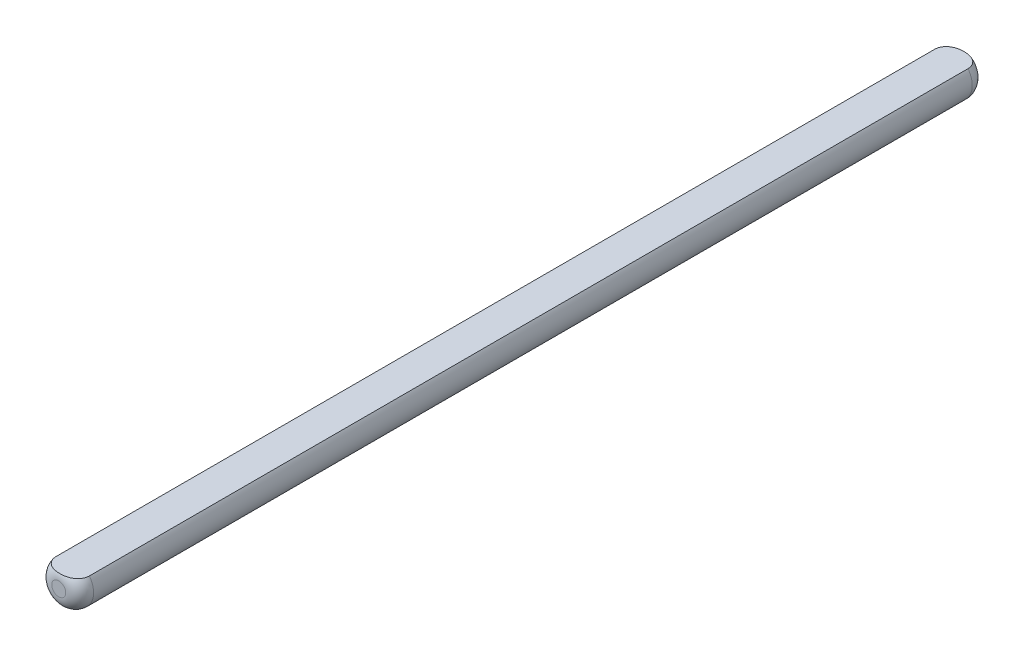
ISO-10303-21;
HEADER;
FILE_DESCRIPTION(('STEP AP214'),'2;1');
FILE_NAME('part.step','',(''),(''),'','','');
FILE_SCHEMA(('AUTOMOTIVE_DESIGN { 1 0 10303 214 1 1 1 1 }'));
ENDSEC;
DATA;
#1=APPLICATION_CONTEXT('core data for automotive mechanical design processes');
#2=APPLICATION_PROTOCOL_DEFINITION('international standard','automotive_design',2000,#1);
#3=PRODUCT_CONTEXT('',#1,'mechanical');
#4=PRODUCT('Part','Part','',(#3));
#5=PRODUCT_RELATED_PRODUCT_CATEGORY('part','',(#4));
#6=PRODUCT_DEFINITION_FORMATION('','',#4);
#7=PRODUCT_DEFINITION_CONTEXT('part definition',#1,'design');
#8=PRODUCT_DEFINITION('design','',#6,#7);
#9=PRODUCT_DEFINITION_SHAPE('','',#8);
#10=(LENGTH_UNIT() NAMED_UNIT(*) SI_UNIT(.MILLI.,.METRE.));
#11=(NAMED_UNIT(*) PLANE_ANGLE_UNIT() SI_UNIT($,.RADIAN.));
#12=(NAMED_UNIT(*) SI_UNIT($,.STERADIAN.) SOLID_ANGLE_UNIT());
#13=UNCERTAINTY_MEASURE_WITH_UNIT(LENGTH_MEASURE(1.E-05),#10,'distance_accuracy_value','');
#14=(GEOMETRIC_REPRESENTATION_CONTEXT(3) GLOBAL_UNCERTAINTY_ASSIGNED_CONTEXT((#13)) GLOBAL_UNIT_ASSIGNED_CONTEXT((#10,
#11,#12)) REPRESENTATION_CONTEXT('',''));
#15=CARTESIAN_POINT('',(0.,0.,0.));
#16=DIRECTION('',(0.,0.,1.));
#17=DIRECTION('',(1.,0.,0.));
#18=AXIS2_PLACEMENT_3D('',#15,#16,#17);
#19=CARTESIAN_POINT('',(0.,0.,130.));
#20=DIRECTION('',(0.,0.,-1.));
#21=DIRECTION('',(-1.,0.,0.));
#22=AXIS2_PLACEMENT_3D('',#19,#20,#21);
#23=CYLINDRICAL_SURFACE('',#22,3.);
#24=CARTESIAN_POINT('',(0.,0.,128.));
#25=DIRECTION('',(0.,0.,1.));
#26=DIRECTION('',(1.,0.,0.));
#27=AXIS2_PLACEMENT_3D('',#24,#25,#26);
#28=CIRCLE('',#27,3.);
#29=CARTESIAN_POINT('',(2.4,1.8,128.));
#30=VERTEX_POINT('',#29);
#31=CARTESIAN_POINT('',(-2.4,1.8,128.));
#32=VERTEX_POINT('',#31);
#33=EDGE_CURVE('E69',#30,#32,#28,.F.);
#34=ORIENTED_EDGE('',*,*,#33,.T.);
#35=DIRECTION('',(0.,0.,-1.));
#36=VECTOR('',#35,1.);
#37=CARTESIAN_POINT('',(-2.4,1.8,130.));
#38=LINE('',#37,#36);
#39=CARTESIAN_POINT('',(-2.4,1.8,2.));
#40=VERTEX_POINT('',#39);
#41=EDGE_CURVE('E52',#32,#40,#38,.T.);
#42=ORIENTED_EDGE('',*,*,#41,.T.);
#43=CARTESIAN_POINT('',(0.,0.,2.));
#44=DIRECTION('',(0.,0.,1.));
#45=DIRECTION('',(1.,0.,0.));
#46=AXIS2_PLACEMENT_3D('',#43,#44,#45);
#47=CIRCLE('',#46,3.);
#48=CARTESIAN_POINT('',(2.4,1.8,2.));
#49=VERTEX_POINT('',#48);
#50=EDGE_CURVE('E71',#40,#49,#47,.T.);
#51=ORIENTED_EDGE('',*,*,#50,.T.);
#52=DIRECTION('',(0.,0.,-1.));
#53=VECTOR('',#52,1.);
#54=CARTESIAN_POINT('',(2.4,1.8,130.));
#55=LINE('',#54,#53);
#56=EDGE_CURVE('E63',#49,#30,#55,.F.);
#57=ORIENTED_EDGE('',*,*,#56,.T.);
#58=EDGE_LOOP('',(#34,#42,#51,#57));
#59=FACE_BOUND('',#58,.T.);
#60=ADVANCED_FACE('F33',(#59),#23,.T.);
#61=CARTESIAN_POINT('',(0.,0.,130.));
#62=DIRECTION('',(0.,0.,1.));
#63=DIRECTION('',(1.,0.,0.));
#64=AXIS2_PLACEMENT_3D('',#61,#62,#63);
#65=PLANE('',#64);
#66=CARTESIAN_POINT('',(0.,0.,130.));
#67=DIRECTION('',(0.,0.,1.));
#68=DIRECTION('',(1.,0.,0.));
#69=AXIS2_PLACEMENT_3D('',#66,#67,#68);
#70=CIRCLE('',#69,1.);
#71=CARTESIAN_POINT('',(1.,0.,130.));
#72=VERTEX_POINT('',#71);
#73=EDGE_CURVE('E46',#72,#72,#70,.T.);
#74=ORIENTED_EDGE('',*,*,#73,.T.);
#75=EDGE_LOOP('',(#74));
#76=FACE_BOUND('',#75,.T.);
#77=ADVANCED_FACE('F87',(#76),#65,.T.);
#78=CARTESIAN_POINT('',(0.,0.,0.));
#79=DIRECTION('',(0.,0.,1.));
#80=DIRECTION('',(1.,0.,0.));
#81=AXIS2_PLACEMENT_3D('',#78,#79,#80);
#82=PLANE('',#81);
#83=CARTESIAN_POINT('',(0.,0.,0.));
#84=DIRECTION('',(0.,0.,1.));
#85=DIRECTION('',(1.,0.,0.));
#86=AXIS2_PLACEMENT_3D('',#83,#84,#85);
#87=CIRCLE('',#86,1.);
#88=CARTESIAN_POINT('',(1.,0.,0.));
#89=VERTEX_POINT('',#88);
#90=EDGE_CURVE('E75',#89,#89,#87,.F.);
#91=ORIENTED_EDGE('',*,*,#90,.T.);
#92=EDGE_LOOP('',(#91));
#93=FACE_BOUND('',#92,.T.);
#94=ADVANCED_FACE('F94',(#93),#82,.F.);
#95=CARTESIAN_POINT('',(0.,0.,2.));
#96=DIRECTION('',(0.,0.,1.));
#97=DIRECTION('',(1.,0.,0.));
#98=AXIS2_PLACEMENT_3D('',#95,#96,#97);
#99=DEGENERATE_TOROIDAL_SURFACE('',#98,1.,2.,.T.);
#100=CARTESIAN_POINT('',(0.,1.8,0.166969722017666));
#101=CARTESIAN_POINT('',(-0.0986785998941134,1.8,0.166975238087045));
#102=CARTESIAN_POINT('',(-0.197346529839382,1.8,0.170477675450817));
#103=CARTESIAN_POINT('',(-0.394209548449965,1.8,0.184913042187482));
#104=CARTESIAN_POINT('',(-0.492404397458323,1.8,0.195849405599045));
#105=CARTESIAN_POINT('',(-0.68720081067676,1.8,0.226181270819594));
#106=CARTESIAN_POINT('',(-0.783806454655332,1.8,0.245549708164188));
#107=CARTESIAN_POINT('',(-0.974465262182511,1.8,0.294071757687691));
#108=CARTESIAN_POINT('',(-1.06852108624494,1.8,0.323214710018872));
#109=CARTESIAN_POINT('',(-1.26583029774225,1.8,0.397560041627408));
#110=CARTESIAN_POINT('',(-1.36845768235951,1.8,0.444470717419789));
#111=CARTESIAN_POINT('',(-1.56509122123428,1.8,0.553888295113033));
#112=CARTESIAN_POINT('',(-1.65910198708867,1.8,0.616386787004061));
#113=CARTESIAN_POINT('',(-1.83552651616728,1.8,0.757508666797526));
#114=CARTESIAN_POINT('',(-1.91784068816743,1.8,0.836257975190657));
#115=CARTESIAN_POINT('',(-2.065979104658,1.8,1.00807150942055));
#116=CARTESIAN_POINT('',(-2.13180888155012,1.8,1.10113091561127));
#117=CARTESIAN_POINT('',(-2.23720083061211,1.8,1.28754255388353));
#118=CARTESIAN_POINT('',(-2.27887474437677,1.8,1.3797028054003));
#119=CARTESIAN_POINT('',(-2.34452577229867,1.8,1.57011541648018));
#120=CARTESIAN_POINT('',(-2.36851347657191,1.8,1.66836409215646));
#121=CARTESIAN_POINT('',(-2.39644764661969,1.8,1.85915363798996));
#122=CARTESIAN_POINT('',(-2.40191765680888,1.8,1.95147438490739));
#123=CARTESIAN_POINT('',(-2.39689553554796,1.8,2.13567111565641));
#124=CARTESIAN_POINT('',(-2.38640678592952,1.8,2.2275471895803));
#125=CARTESIAN_POINT('',(-2.35030117415979,1.8,2.40613408615349));
#126=CARTESIAN_POINT('',(-2.32502501802913,1.8,2.49291427573677));
#127=CARTESIAN_POINT('',(-2.26058356546414,1.8,2.66113019876751));
#128=CARTESIAN_POINT('',(-2.22141882918956,1.8,2.74256614760406));
#129=CARTESIAN_POINT('',(-2.12955683902653,1.8,2.89994959923916));
#130=CARTESIAN_POINT('',(-2.07656511403947,1.8,2.97572467287087));
#131=CARTESIAN_POINT('',(-1.95939791386091,1.8,3.11806122730967));
#132=CARTESIAN_POINT('',(-1.89521774629078,1.8,3.18461882125054));
#133=CARTESIAN_POINT('',(-1.75271671613515,1.8,3.31204250166765));
#134=CARTESIAN_POINT('',(-1.67370313469296,1.8,3.37213038880669));
#135=CARTESIAN_POINT('',(-1.50786459976306,1.8,3.48010981150634));
#136=CARTESIAN_POINT('',(-1.42104320451761,1.8,3.52800686503826));
#137=CARTESIAN_POINT('',(-1.26390306676421,1.8,3.60175998818603));
#138=CARTESIAN_POINT('',(-1.19474255503857,1.8,3.63014162439646));
#139=CARTESIAN_POINT('',(-1.05416593877488,1.8,3.68063819903391));
#140=CARTESIAN_POINT('',(-0.982749379954744,1.8,3.70275186627457));
#141=CARTESIAN_POINT('',(-0.838034036058117,1.8,3.74134266505989));
#142=CARTESIAN_POINT('',(-0.76472741262721,1.8,3.75778998184676));
#143=CARTESIAN_POINT('',(-0.617157947681998,1.8,3.78549164477229));
#144=CARTESIAN_POINT('',(-0.542895096326035,1.8,3.7967459374195));
#145=CARTESIAN_POINT('',(-0.358348827697383,1.8,3.81888706504936));
#146=CARTESIAN_POINT('',(-0.247737219781189,1.8,3.82705178049354));
#147=CARTESIAN_POINT('',(-0.0261563081097727,1.8,3.83445046479966));
#148=CARTESIAN_POINT('',(0.0848132146458739,1.8,3.83367710165681));
#149=CARTESIAN_POINT('',(0.306020069167073,1.8,3.82307860982982));
#150=CARTESIAN_POINT('',(0.416258594625243,1.8,3.8132801259526));
#151=CARTESIAN_POINT('',(0.635242041818319,1.8,3.7833889265005));
#152=CARTESIAN_POINT('',(0.74398862547722,1.8,3.76330881655314));
#153=CARTESIAN_POINT('',(0.970440557346135,1.8,3.70805597598123));
#154=CARTESIAN_POINT('',(1.08781482330207,1.8,3.6714655182648));
#155=CARTESIAN_POINT('',(1.31559913991839,1.8,3.58089149859709));
#156=CARTESIAN_POINT('',(1.42602039299972,1.8,3.52693681748993));
#157=CARTESIAN_POINT('',(1.63698214306462,1.8,3.39965509628724));
#158=CARTESIAN_POINT('',(1.73739712118393,1.8,3.32611638038127));
#159=CARTESIAN_POINT('',(1.92177182460297,1.8,3.16048672940832));
#160=CARTESIAN_POINT('',(2.00573510880869,1.8,3.06839981553315));
#161=CARTESIAN_POINT('',(2.14170378773492,1.8,2.88268700099884));
#162=CARTESIAN_POINT('',(2.19655590053385,1.8,2.7911424114992));
#163=CARTESIAN_POINT('',(2.28775023694629,1.8,2.59927472144413));
#164=CARTESIAN_POINT('',(2.32410951262713,1.8,2.49895980833114));
#165=CARTESIAN_POINT('',(2.37344556135317,1.8,2.30513950926308));
#166=CARTESIAN_POINT('',(2.38864566212387,1.8,2.2121942845736));
#167=CARTESIAN_POINT('',(2.40254652843964,1.8,2.02508558426061));
#168=CARTESIAN_POINT('',(2.40125250179713,1.8,1.93092250254016));
#169=CARTESIAN_POINT('',(2.38259230347494,1.8,1.74786718588304));
#170=CARTESIAN_POINT('',(2.36584296863454,1.8,1.65891112953878));
#171=CARTESIAN_POINT('',(2.3177948786314,1.8,1.48503513443969));
#172=CARTESIAN_POINT('',(2.28649679833613,1.8,1.40011500867296));
#173=CARTESIAN_POINT('',(2.21011098434111,1.8,1.23563696772895));
#174=CARTESIAN_POINT('',(2.16487938683766,1.8,1.15614609480629));
#175=CARTESIAN_POINT('',(2.06239114822016,1.8,1.00536938877244));
#176=CARTESIAN_POINT('',(2.00513292643795,1.8,0.934084636106138));
#177=CARTESIAN_POINT('',(1.87694794583826,1.8,0.797209267821055));
#178=CARTESIAN_POINT('',(1.80542713631104,1.8,0.732176714614894));
#179=CARTESIAN_POINT('',(1.6535258887066,1.8,0.613512927513511));
#180=CARTESIAN_POINT('',(1.57314145111642,1.8,0.559886872774925));
#181=CARTESIAN_POINT('',(1.37120696379265,1.8,0.444290804678226));
#182=CARTESIAN_POINT('',(1.24637956290656,1.8,0.388040119487766));
#183=CARTESIAN_POINT('',(0.989376682558869,1.8,0.296476142840079));
#184=CARTESIAN_POINT('',(0.857190636952698,1.8,0.261193854321601));
#185=CARTESIAN_POINT('',(0.604491105474044,1.8,0.211015292219229));
#186=CARTESIAN_POINT('',(0.484321810099182,1.8,0.194282993609102));
#187=CARTESIAN_POINT('',(0.242764158095312,1.8,0.172246586378911));
#188=CARTESIAN_POINT('',(0.121374007853963,1.8,0.166962937289783));
#189=CARTESIAN_POINT('',(0.,1.8,0.166969722017666));
#190=B_SPLINE_CURVE_WITH_KNOTS('',3,(#100,#101,#102,#103,#104,#105,#106,#107,#108,#109,#110,
#111,#112,#113,#114,#115,#116,#117,#118,#119,#120,#121,#122,#123,#124,#125,#126,#127,#128,#129,
#130,#131,#132,#133,#134,#135,#136,#137,#138,#139,#140,#141,#142,#143,#144,#145,#146,#147,#148,
#149,#150,#151,#152,#153,#154,#155,#156,#157,#158,#159,#160,#161,#162,#163,#164,#165,#166,#167,
#168,#169,#170,#171,#172,#173,#174,#175,#176,#177,#178,#179,#180,#181,#182,#183,#184,#185,#186,
#187,#188,#189),.UNSPECIFIED.,.T.,.F.,(4,2,2,2,2,2,2,2,2,2,2,2,2,2,2,2,2,2,2,2,2,2,2,2,2,2,2,2,
2,2,2,2,2,2,2,2,2,2,2,2,2,2,2,2,4),(0.,0.295949653695498,0.592036111796913,0.887179146832613,
1.18200134704731,1.51927976293908,1.85637660099008,2.19619075075287,2.5358907006511,
2.83767550406189,3.13927945824436,3.41537263411145,3.6914073110335,3.96131945882432,
4.2312207216487,4.50742049637946,4.78373638786554,5.0803670815448,5.3768632707044,
5.60083274182996,5.82484760302654,6.05002378312748,6.27520228263474,6.60750999736436,
6.9400903271253,7.2716919184159,7.60288792476429,7.97053125870932,8.33756624716975,
8.70874180895325,9.07983698747111,9.39815717912841,9.71618331622703,9.99731399926407,
10.278355921038,10.5486447906642,10.8189211237476,11.0920873088679,11.3652894189135,
11.6541014321146,11.9430443027048,12.351468674033,12.7604954307166,13.1238626665679,
13.4878787311509),.UNSPECIFIED.);
#191=EDGE_CURVE('E57',#49,#40,#190,.T.);
#192=ORIENTED_EDGE('',*,*,#191,.F.);
#193=ORIENTED_EDGE('',*,*,#50,.F.);
#194=EDGE_LOOP('',(#192,#193));
#195=FACE_BOUND('',#194,.T.);
#196=ORIENTED_EDGE('',*,*,#90,.F.);
#197=EDGE_LOOP('',(#196));
#198=FACE_BOUND('',#197,.T.);
#199=ADVANCED_FACE('F89',(#195,#198),#99,.T.);
#200=CARTESIAN_POINT('',(0.,0.,128.));
#201=DIRECTION('',(0.,0.,1.));
#202=DIRECTION('',(1.,0.,0.));
#203=AXIS2_PLACEMENT_3D('',#200,#201,#202);
#204=DEGENERATE_TOROIDAL_SURFACE('',#203,1.,2.,.T.);
#205=CARTESIAN_POINT('',(0.,1.8,129.833030277982));
#206=CARTESIAN_POINT('',(0.0986785998941123,1.8,129.833024761913));
#207=CARTESIAN_POINT('',(0.19734652983938,1.8,129.829522324549));
#208=CARTESIAN_POINT('',(0.394209548449963,1.8,129.815086957813));
#209=CARTESIAN_POINT('',(0.492404397458321,1.8,129.804150594401));
#210=CARTESIAN_POINT('',(0.687200810676758,1.8,129.77381872918));
#211=CARTESIAN_POINT('',(0.783806454655327,1.8,129.754450291836));
#212=CARTESIAN_POINT('',(0.974465262182507,1.8,129.705928242312));
#213=CARTESIAN_POINT('',(1.06852108624494,1.8,129.676785289981));
#214=CARTESIAN_POINT('',(1.26583029774225,1.8,129.602439958373));
#215=CARTESIAN_POINT('',(1.36845768235951,1.8,129.55552928258));
#216=CARTESIAN_POINT('',(1.56509122123427,1.8,129.446111704887));
#217=CARTESIAN_POINT('',(1.65910198708867,1.8,129.383613212996));
#218=CARTESIAN_POINT('',(1.83552651616729,1.8,129.242491333202));
#219=CARTESIAN_POINT('',(1.91784068816743,1.8,129.163742024809));
#220=CARTESIAN_POINT('',(2.065979104658,1.8,128.991928490579));
#221=CARTESIAN_POINT('',(2.13180888155013,1.8,128.898869084389));
#222=CARTESIAN_POINT('',(2.23720083061211,1.8,128.712457446116));
#223=CARTESIAN_POINT('',(2.27887474437677,1.8,128.6202971946));
#224=CARTESIAN_POINT('',(2.34452577229868,1.8,128.42988458352));
#225=CARTESIAN_POINT('',(2.36851347657191,1.8,128.331635907844));
#226=CARTESIAN_POINT('',(2.39644764661969,1.8,128.14084636201));
#227=CARTESIAN_POINT('',(2.40191765680888,1.8,128.048525615093));
#228=CARTESIAN_POINT('',(2.39689553554796,1.8,127.864328884344));
#229=CARTESIAN_POINT('',(2.38640678592952,1.8,127.77245281042));
#230=CARTESIAN_POINT('',(2.35030117415979,1.8,127.593865913846));
#231=CARTESIAN_POINT('',(2.32502501802913,1.8,127.507085724263));
#232=CARTESIAN_POINT('',(2.26058356546413,1.8,127.338869801232));
#233=CARTESIAN_POINT('',(2.22141882918955,1.8,127.257433852396));
#234=CARTESIAN_POINT('',(2.12955683902652,1.8,127.100050400761));
#235=CARTESIAN_POINT('',(2.07656511403947,1.8,127.024275327129));
#236=CARTESIAN_POINT('',(1.9593979138609,1.8,126.88193877269));
#237=CARTESIAN_POINT('',(1.89521774629078,1.8,126.815381178749));
#238=CARTESIAN_POINT('',(1.75271671613514,1.8,126.687957498332));
#239=CARTESIAN_POINT('',(1.67370313469295,1.8,126.627869611193));
#240=CARTESIAN_POINT('',(1.50786459976304,1.8,126.519890188494));
#241=CARTESIAN_POINT('',(1.4210432045176,1.8,126.471993134962));
#242=CARTESIAN_POINT('',(1.2639030667642,1.8,126.398240011814));
#243=CARTESIAN_POINT('',(1.19474255503856,1.8,126.369858375604));
#244=CARTESIAN_POINT('',(1.05416593877488,1.8,126.319361800966));
#245=CARTESIAN_POINT('',(0.982749379954742,1.8,126.297248133725));
#246=CARTESIAN_POINT('',(0.838034036058111,1.8,126.25865733494));
#247=CARTESIAN_POINT('',(0.7647274126272,1.8,126.242210018153));
#248=CARTESIAN_POINT('',(0.617157947681986,1.8,126.214508355228));
#249=CARTESIAN_POINT('',(0.542895096326025,1.8,126.203254062581));
#250=CARTESIAN_POINT('',(0.358348827697375,1.8,126.181112934951));
#251=CARTESIAN_POINT('',(0.24773721978118,1.8,126.172948219506));
#252=CARTESIAN_POINT('',(0.0261563081097636,1.8,126.1655495352));
#253=CARTESIAN_POINT('',(-0.0848132146458825,1.8,126.166322898343));
#254=CARTESIAN_POINT('',(-0.306020069167082,1.8,126.17692139017));
#255=CARTESIAN_POINT('',(-0.416258594625251,1.8,126.186719874047));
#256=CARTESIAN_POINT('',(-0.635242041818326,1.8,126.2166110735));
#257=CARTESIAN_POINT('',(-0.743988625477226,1.8,126.236691183447));
#258=CARTESIAN_POINT('',(-0.970440557346138,1.8,126.291944024019));
#259=CARTESIAN_POINT('',(-1.08781482330207,1.8,126.328534481735));
#260=CARTESIAN_POINT('',(-1.31559913991839,1.8,126.419108501403));
#261=CARTESIAN_POINT('',(-1.42602039299972,1.8,126.47306318251));
#262=CARTESIAN_POINT('',(-1.63698214306463,1.8,126.600344903713));
#263=CARTESIAN_POINT('',(-1.73739712118393,1.8,126.673883619619));
#264=CARTESIAN_POINT('',(-1.92177182460299,1.8,126.839513270592));
#265=CARTESIAN_POINT('',(-2.0057351088087,1.8,126.931600184467));
#266=CARTESIAN_POINT('',(-2.14170378773493,1.8,127.117312999001));
#267=CARTESIAN_POINT('',(-2.19655590053386,1.8,127.208857588501));
#268=CARTESIAN_POINT('',(-2.28775023694629,1.8,127.400725278556));
#269=CARTESIAN_POINT('',(-2.32410951262713,1.8,127.501040191669));
#270=CARTESIAN_POINT('',(-2.37344556135318,1.8,127.694860490737));
#271=CARTESIAN_POINT('',(-2.38864566212387,1.8,127.787805715426));
#272=CARTESIAN_POINT('',(-2.40254652843964,1.8,127.974914415739));
#273=CARTESIAN_POINT('',(-2.40125250179712,1.8,128.06907749746));
#274=CARTESIAN_POINT('',(-2.38259230347494,1.8,128.252132814117));
#275=CARTESIAN_POINT('',(-2.36584296863455,1.8,128.341088870461));
#276=CARTESIAN_POINT('',(-2.31779487863141,1.8,128.51496486556));
#277=CARTESIAN_POINT('',(-2.28649679833614,1.8,128.599884991327));
#278=CARTESIAN_POINT('',(-2.21011098434111,1.8,128.764363032271));
#279=CARTESIAN_POINT('',(-2.16487938683766,1.8,128.843853905194));
#280=CARTESIAN_POINT('',(-2.06239114822017,1.8,128.994630611228));
#281=CARTESIAN_POINT('',(-2.00513292643796,1.8,129.065915363894));
#282=CARTESIAN_POINT('',(-1.87694794583828,1.8,129.202790732179));
#283=CARTESIAN_POINT('',(-1.80542713631105,1.8,129.267823285385));
#284=CARTESIAN_POINT('',(-1.6535258887066,1.8,129.386487072487));
#285=CARTESIAN_POINT('',(-1.57314145111641,1.8,129.440113127225));
#286=CARTESIAN_POINT('',(-1.37120696379265,1.8,129.555709195322));
#287=CARTESIAN_POINT('',(-1.24637956290655,1.8,129.611959880512));
#288=CARTESIAN_POINT('',(-0.98937668255886,1.8,129.70352385716));
#289=CARTESIAN_POINT('',(-0.857190636952684,1.8,129.738806145678));
#290=CARTESIAN_POINT('',(-0.604491105474029,1.8,129.788984707781));
#291=CARTESIAN_POINT('',(-0.48432181009917,1.8,129.805717006391));
#292=CARTESIAN_POINT('',(-0.242764158095306,1.8,129.827753413621));
#293=CARTESIAN_POINT('',(-0.12137400785396,1.8,129.83303706271));
#294=CARTESIAN_POINT('',(0.,1.8,129.833030277982));
#295=B_SPLINE_CURVE_WITH_KNOTS('',3,(#205,#206,#207,#208,#209,#210,#211,#212,#213,#214,#215,
#216,#217,#218,#219,#220,#221,#222,#223,#224,#225,#226,#227,#228,#229,#230,#231,#232,#233,#234,
#235,#236,#237,#238,#239,#240,#241,#242,#243,#244,#245,#246,#247,#248,#249,#250,#251,#252,#253,
#254,#255,#256,#257,#258,#259,#260,#261,#262,#263,#264,#265,#266,#267,#268,#269,#270,#271,#272,
#273,#274,#275,#276,#277,#278,#279,#280,#281,#282,#283,#284,#285,#286,#287,#288,#289,#290,#291,
#292,#293,#294),.UNSPECIFIED.,.T.,.F.,(4,2,2,2,2,2,2,2,2,2,2,2,2,2,2,2,2,2,2,2,2,2,2,2,2,2,2,2,
2,2,2,2,2,2,2,2,2,2,2,2,2,2,2,2,4),(0.,0.295949653695496,0.59203611179691,0.887179146832611,
1.1820013470473,1.51927976293908,1.85637660099007,2.19619075075287,2.53589070065112,
2.83767550406188,3.13927945824434,3.41537263411145,3.69140731103349,3.96131945882433,
4.23122072164871,4.50742049637948,4.78373638786555,5.08036708154481,5.3768632707044,
5.60083274182997,5.82484760302653,6.05002378312748,6.27520228263474,6.60750999736436,
6.9400903271253,7.2716919184159,7.60288792476429,7.97053125870931,8.33756624716976,
8.70874180895326,9.07983698747112,9.39815717912843,9.71618331622702,9.99731399926408,
10.278355921038,10.5486447906641,10.8189211237476,11.0920873088679,11.3652894189135,
11.6541014321146,11.9430443027048,12.351468674033,12.7604954307166,13.1238626665679,
13.4878787311509),.UNSPECIFIED.);
#296=EDGE_CURVE('E11',#32,#30,#295,.T.);
#297=ORIENTED_EDGE('',*,*,#296,.F.);
#298=ORIENTED_EDGE('',*,*,#33,.F.);
#299=EDGE_LOOP('',(#297,#298));
#300=FACE_BOUND('',#299,.T.);
#301=ORIENTED_EDGE('',*,*,#73,.F.);
#302=EDGE_LOOP('',(#301));
#303=FACE_BOUND('',#302,.T.);
#304=ADVANCED_FACE('F35',(#300,#303),#204,.T.);
#305=CARTESIAN_POINT('',(-3.,1.8,0.));
#306=DIRECTION('',(0.,-1.,0.));
#307=DIRECTION('',(0.,0.,-1.));
#308=AXIS2_PLACEMENT_3D('',#305,#306,#307);
#309=PLANE('',#308);
#310=ORIENTED_EDGE('',*,*,#191,.T.);
#311=ORIENTED_EDGE('',*,*,#41,.F.);
#312=ORIENTED_EDGE('',*,*,#296,.T.);
#313=ORIENTED_EDGE('',*,*,#56,.F.);
#314=EDGE_LOOP('',(#310,#311,#312,#313));
#315=FACE_BOUND('',#314,.T.);
#316=ADVANCED_FACE('F62',(#315),#309,.F.);
#317=CLOSED_SHELL('',(#60,#77,#94,#199,#304,#316));
#318=MANIFOLD_SOLID_BREP('B2',#317);
#319=ADVANCED_BREP_SHAPE_REPRESENTATION('',(#18,#318),#14);
#320=SHAPE_DEFINITION_REPRESENTATION(#9,#319);
ENDSEC;
END-ISO-10303-21;
